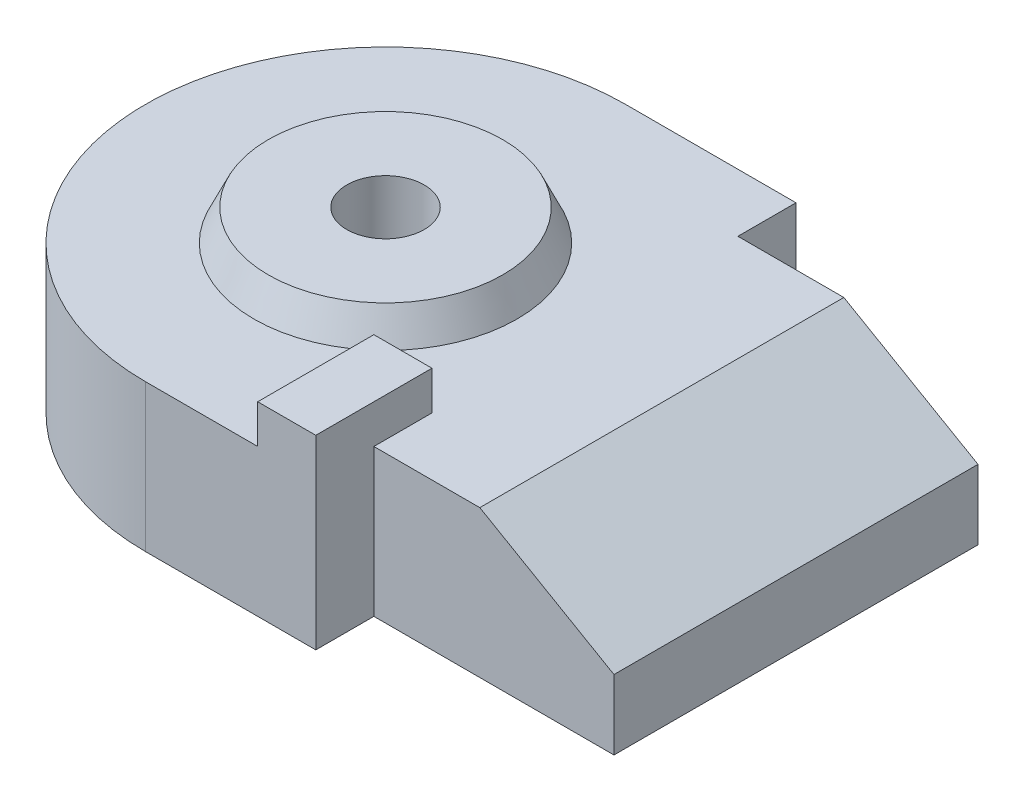
ISO-10303-21;
HEADER;
FILE_DESCRIPTION(('STEP AP214'),'2;1');
FILE_NAME('part.step','',(''),(''),'','','');
FILE_SCHEMA(('AUTOMOTIVE_DESIGN { 1 0 10303 214 1 1 1 1 }'));
ENDSEC;
DATA;
#1=APPLICATION_CONTEXT('core data for automotive mechanical design processes');
#2=APPLICATION_PROTOCOL_DEFINITION('international standard','automotive_design',2000,#1);
#3=PRODUCT_CONTEXT('',#1,'mechanical');
#4=PRODUCT('Part','Part','',(#3));
#5=PRODUCT_RELATED_PRODUCT_CATEGORY('part','',(#4));
#6=PRODUCT_DEFINITION_FORMATION('','',#4);
#7=PRODUCT_DEFINITION_CONTEXT('part definition',#1,'design');
#8=PRODUCT_DEFINITION('design','',#6,#7);
#9=PRODUCT_DEFINITION_SHAPE('','',#8);
#10=(LENGTH_UNIT() NAMED_UNIT(*) SI_UNIT(.MILLI.,.METRE.));
#11=(NAMED_UNIT(*) PLANE_ANGLE_UNIT() SI_UNIT($,.RADIAN.));
#12=(NAMED_UNIT(*) SI_UNIT($,.STERADIAN.) SOLID_ANGLE_UNIT());
#13=UNCERTAINTY_MEASURE_WITH_UNIT(LENGTH_MEASURE(1.E-05),#10,'distance_accuracy_value','');
#14=(GEOMETRIC_REPRESENTATION_CONTEXT(3) GLOBAL_UNCERTAINTY_ASSIGNED_CONTEXT((#13)) GLOBAL_UNIT_ASSIGNED_CONTEXT((#10,
#11,#12)) REPRESENTATION_CONTEXT('',''));
#15=CARTESIAN_POINT('',(0.,0.,0.));
#16=DIRECTION('',(0.,0.,1.));
#17=DIRECTION('',(1.,0.,0.));
#18=AXIS2_PLACEMENT_3D('',#15,#16,#17);
#19=CARTESIAN_POINT('',(-220.,190.,-235.));
#20=DIRECTION('',(0.,-1.,0.));
#21=DIRECTION('',(0.,0.,-1.));
#22=AXIS2_PLACEMENT_3D('',#19,#20,#21);
#23=PLANE('',#22);
#24=CARTESIAN_POINT('',(-220.,190.,-235.));
#25=DIRECTION('',(0.,-1.,0.));
#26=DIRECTION('',(0.,0.,-1.));
#27=AXIS2_PLACEMENT_3D('',#24,#25,#26);
#28=CIRCLE('',#27,170.);
#29=CARTESIAN_POINT('',(-220.,190.,-405.));
#30=VERTEX_POINT('',#29);
#31=EDGE_CURVE('E189',#30,#30,#28,.F.);
#32=ORIENTED_EDGE('',*,*,#31,.F.);
#33=EDGE_LOOP('',(#32));
#34=FACE_BOUND('',#33,.T.);
#35=DIRECTION('',(1.,0.,0.));
#36=VECTOR('',#35,1.);
#37=CARTESIAN_POINT('',(310.,190.,0.));
#38=LINE('',#37,#36);
#39=CARTESIAN_POINT('',(0.,190.,0.));
#40=VERTEX_POINT('',#39);
#41=CARTESIAN_POINT('',(136.794919243114,190.,0.));
#42=VERTEX_POINT('',#41);
#43=EDGE_CURVE('E132',#40,#42,#38,.T.);
#44=ORIENTED_EDGE('',*,*,#43,.T.);
#45=DIRECTION('',(0.,0.,1.));
#46=VECTOR('',#45,1.);
#47=CARTESIAN_POINT('',(136.794919243114,190.,-545.));
#48=LINE('',#47,#46);
#49=CARTESIAN_POINT('',(136.794919243114,190.,-470.));
#50=VERTEX_POINT('',#49);
#51=EDGE_CURVE('E121',#50,#42,#48,.T.);
#52=ORIENTED_EDGE('',*,*,#51,.F.);
#53=DIRECTION('',(-1.,0.,0.));
#54=VECTOR('',#53,1.);
#55=CARTESIAN_POINT('',(0.,190.,-470.));
#56=LINE('',#55,#54);
#57=CARTESIAN_POINT('',(0.,190.,-470.));
#58=VERTEX_POINT('',#57);
#59=EDGE_CURVE('E137',#50,#58,#56,.T.);
#60=ORIENTED_EDGE('',*,*,#59,.T.);
#61=DIRECTION('',(0.,0.,-1.));
#62=VECTOR('',#61,1.);
#63=CARTESIAN_POINT('',(0.,190.,-545.));
#64=LINE('',#63,#62);
#65=CARTESIAN_POINT('',(0.,190.,-545.));
#66=VERTEX_POINT('',#65);
#67=EDGE_CURVE('E140',#58,#66,#64,.T.);
#68=ORIENTED_EDGE('',*,*,#67,.T.);
#69=DIRECTION('',(-1.,0.,0.));
#70=VECTOR('',#69,1.);
#71=CARTESIAN_POINT('',(-220.,190.,-545.));
#72=LINE('',#71,#70);
#73=CARTESIAN_POINT('',(-220.,190.,-545.));
#74=VERTEX_POINT('',#73);
#75=EDGE_CURVE('E149',#66,#74,#72,.T.);
#76=ORIENTED_EDGE('',*,*,#75,.T.);
#77=CARTESIAN_POINT('',(-220.,190.,-235.));
#78=DIRECTION('',(0.,1.,0.));
#79=DIRECTION('',(0.,0.,-1.));
#80=AXIS2_PLACEMENT_3D('',#77,#78,#79);
#81=CIRCLE('',#80,310.);
#82=CARTESIAN_POINT('',(-220.,190.,75.));
#83=VERTEX_POINT('',#82);
#84=EDGE_CURVE('E151',#74,#83,#81,.T.);
#85=ORIENTED_EDGE('',*,*,#84,.T.);
#86=DIRECTION('',(1.,0.,0.));
#87=VECTOR('',#86,1.);
#88=CARTESIAN_POINT('',(0.,190.,75.));
#89=LINE('',#88,#87);
#90=CARTESIAN_POINT('',(-75.,190.,75.));
#91=VERTEX_POINT('',#90);
#92=EDGE_CURVE('E153',#83,#91,#89,.T.);
#93=ORIENTED_EDGE('',*,*,#92,.T.);
#94=DIRECTION('',(0.,0.,1.));
#95=VECTOR('',#94,1.);
#96=CARTESIAN_POINT('',(-75.,190.,75.));
#97=LINE('',#96,#95);
#98=CARTESIAN_POINT('',(-75.,190.,-75.));
#99=VERTEX_POINT('',#98);
#100=EDGE_CURVE('E211',#99,#91,#97,.T.);
#101=ORIENTED_EDGE('',*,*,#100,.F.);
#102=DIRECTION('',(-1.,0.,0.));
#103=VECTOR('',#102,1.);
#104=CARTESIAN_POINT('',(0.,190.,-75.));
#105=LINE('',#104,#103);
#106=CARTESIAN_POINT('',(0.,190.,-75.));
#107=VERTEX_POINT('',#106);
#108=EDGE_CURVE('E57',#107,#99,#105,.T.);
#109=ORIENTED_EDGE('',*,*,#108,.F.);
#110=DIRECTION('',(0.,0.,-1.));
#111=VECTOR('',#110,1.);
#112=CARTESIAN_POINT('',(0.,190.,-235.));
#113=LINE('',#112,#111);
#114=EDGE_CURVE('E43',#40,#107,#113,.T.);
#115=ORIENTED_EDGE('',*,*,#114,.F.);
#116=EDGE_LOOP('',(#44,#52,#60,#68,#76,#85,#93,#101,#109,#115));
#117=FACE_BOUND('',#116,.T.);
#118=ADVANCED_FACE('F35',(#34,#117),#23,.F.);
#119=CARTESIAN_POINT('',(310.,190.,0.));
#120=DIRECTION('',(0.,0.,-1.));
#121=DIRECTION('',(-1.,0.,0.));
#122=AXIS2_PLACEMENT_3D('',#119,#120,#121);
#123=PLANE('',#122);
#124=DIRECTION('',(0.,-1.,0.));
#125=VECTOR('',#124,1.);
#126=CARTESIAN_POINT('',(310.,190.,0.));
#127=LINE('',#126,#125);
#128=CARTESIAN_POINT('',(310.,89.9999999999999,0.));
#129=VERTEX_POINT('',#128);
#130=CARTESIAN_POINT('',(310.,0.,0.));
#131=VERTEX_POINT('',#130);
#132=EDGE_CURVE('E134',#129,#131,#127,.T.);
#133=ORIENTED_EDGE('',*,*,#132,.F.);
#134=DIRECTION('',(0.866025403784436,-0.500000000000004,0.));
#135=VECTOR('',#134,1.);
#136=CARTESIAN_POINT('',(116.471143170301,201.733937586588,0.));
#137=LINE('',#136,#135);
#138=EDGE_CURVE('E124',#42,#129,#137,.T.);
#139=ORIENTED_EDGE('',*,*,#138,.F.);
#140=ORIENTED_EDGE('',*,*,#43,.F.);
#141=DIRECTION('',(0.,-1.,0.));
#142=VECTOR('',#141,1.);
#143=CARTESIAN_POINT('',(0.,190.,0.));
#144=LINE('',#143,#142);
#145=CARTESIAN_POINT('',(0.,0.,0.));
#146=VERTEX_POINT('',#145);
#147=EDGE_CURVE('E155',#40,#146,#144,.T.);
#148=ORIENTED_EDGE('',*,*,#147,.T.);
#149=DIRECTION('',(1.,0.,0.));
#150=VECTOR('',#149,1.);
#151=CARTESIAN_POINT('',(310.,0.,0.));
#152=LINE('',#151,#150);
#153=EDGE_CURVE('E156',#146,#131,#152,.T.);
#154=ORIENTED_EDGE('',*,*,#153,.T.);
#155=EDGE_LOOP('',(#133,#139,#140,#148,#154));
#156=FACE_BOUND('',#155,.T.);
#157=ADVANCED_FACE('F37',(#156),#123,.F.);
#158=CARTESIAN_POINT('',(310.,190.,-470.));
#159=DIRECTION('',(-1.,0.,0.));
#160=DIRECTION('',(0.,0.,1.));
#161=AXIS2_PLACEMENT_3D('',#158,#159,#160);
#162=PLANE('',#161);
#163=DIRECTION('',(0.,-1.,0.));
#164=VECTOR('',#163,1.);
#165=CARTESIAN_POINT('',(310.,190.,-470.));
#166=LINE('',#165,#164);
#167=CARTESIAN_POINT('',(310.,90.,-470.));
#168=VERTEX_POINT('',#167);
#169=CARTESIAN_POINT('',(310.,0.,-470.));
#170=VERTEX_POINT('',#169);
#171=EDGE_CURVE('E186',#168,#170,#166,.T.);
#172=ORIENTED_EDGE('',*,*,#171,.F.);
#173=DIRECTION('',(0.,0.,1.));
#174=VECTOR('',#173,1.);
#175=CARTESIAN_POINT('',(310.,89.9999999999999,-545.));
#176=LINE('',#175,#174);
#177=EDGE_CURVE('E50',#168,#129,#176,.T.);
#178=ORIENTED_EDGE('',*,*,#177,.T.);
#179=ORIENTED_EDGE('',*,*,#132,.T.);
#180=DIRECTION('',(0.,0.,-1.));
#181=VECTOR('',#180,1.);
#182=CARTESIAN_POINT('',(310.,0.,-470.));
#183=LINE('',#182,#181);
#184=EDGE_CURVE('E158',#131,#170,#183,.T.);
#185=ORIENTED_EDGE('',*,*,#184,.T.);
#186=EDGE_LOOP('',(#172,#178,#179,#185));
#187=FACE_BOUND('',#186,.T.);
#188=ADVANCED_FACE('F230',(#187),#162,.F.);
#189=CARTESIAN_POINT('',(0.,190.,-470.));
#190=DIRECTION('',(0.,0.,1.));
#191=DIRECTION('',(1.,0.,0.));
#192=AXIS2_PLACEMENT_3D('',#189,#190,#191);
#193=PLANE('',#192);
#194=ORIENTED_EDGE('',*,*,#59,.F.);
#195=DIRECTION('',(0.866025403784436,-0.500000000000004,0.));
#196=VECTOR('',#195,1.);
#197=CARTESIAN_POINT('',(34.1987298107791,249.233937586589,-470.));
#198=LINE('',#197,#196);
#199=EDGE_CURVE('E11',#50,#168,#198,.T.);
#200=ORIENTED_EDGE('',*,*,#199,.T.);
#201=ORIENTED_EDGE('',*,*,#171,.T.);
#202=DIRECTION('',(-1.,0.,0.));
#203=VECTOR('',#202,1.);
#204=CARTESIAN_POINT('',(0.,0.,-470.));
#205=LINE('',#204,#203);
#206=CARTESIAN_POINT('',(0.,0.,-470.));
#207=VERTEX_POINT('',#206);
#208=EDGE_CURVE('E161',#170,#207,#205,.T.);
#209=ORIENTED_EDGE('',*,*,#208,.T.);
#210=DIRECTION('',(0.,-1.,0.));
#211=VECTOR('',#210,1.);
#212=CARTESIAN_POINT('',(0.,190.,-470.));
#213=LINE('',#212,#211);
#214=EDGE_CURVE('E183',#58,#207,#213,.T.);
#215=ORIENTED_EDGE('',*,*,#214,.F.);
#216=EDGE_LOOP('',(#194,#200,#201,#209,#215));
#217=FACE_BOUND('',#216,.T.);
#218=ADVANCED_FACE('F234',(#217),#193,.F.);
#219=CARTESIAN_POINT('',(0.,190.,-545.));
#220=DIRECTION('',(-1.,0.,0.));
#221=DIRECTION('',(0.,0.,1.));
#222=AXIS2_PLACEMENT_3D('',#219,#220,#221);
#223=PLANE('',#222);
#224=DIRECTION('',(0.,0.,-1.));
#225=VECTOR('',#224,1.);
#226=CARTESIAN_POINT('',(0.,0.,-545.));
#227=LINE('',#226,#225);
#228=CARTESIAN_POINT('',(0.,0.,-545.));
#229=VERTEX_POINT('',#228);
#230=EDGE_CURVE('E163',#207,#229,#227,.T.);
#231=ORIENTED_EDGE('',*,*,#230,.T.);
#232=DIRECTION('',(0.,-1.,0.));
#233=VECTOR('',#232,1.);
#234=CARTESIAN_POINT('',(0.,190.,-545.));
#235=LINE('',#234,#233);
#236=EDGE_CURVE('E180',#66,#229,#235,.T.);
#237=ORIENTED_EDGE('',*,*,#236,.F.);
#238=ORIENTED_EDGE('',*,*,#67,.F.);
#239=ORIENTED_EDGE('',*,*,#214,.T.);
#240=EDGE_LOOP('',(#231,#237,#238,#239));
#241=FACE_BOUND('',#240,.T.);
#242=ADVANCED_FACE('F241',(#241),#223,.F.);
#243=CARTESIAN_POINT('',(-220.,190.,-545.));
#244=DIRECTION('',(0.,0.,1.));
#245=DIRECTION('',(1.,0.,0.));
#246=AXIS2_PLACEMENT_3D('',#243,#244,#245);
#247=PLANE('',#246);
#248=DIRECTION('',(-1.,0.,0.));
#249=VECTOR('',#248,1.);
#250=CARTESIAN_POINT('',(-220.,0.,-545.));
#251=LINE('',#250,#249);
#252=CARTESIAN_POINT('',(-220.,0.,-545.));
#253=VERTEX_POINT('',#252);
#254=EDGE_CURVE('E165',#229,#253,#251,.T.);
#255=ORIENTED_EDGE('',*,*,#254,.T.);
#256=DIRECTION('',(0.,-1.,0.));
#257=VECTOR('',#256,1.);
#258=CARTESIAN_POINT('',(-220.,190.,-545.));
#259=LINE('',#258,#257);
#260=EDGE_CURVE('E177',#74,#253,#259,.T.);
#261=ORIENTED_EDGE('',*,*,#260,.F.);
#262=ORIENTED_EDGE('',*,*,#75,.F.);
#263=ORIENTED_EDGE('',*,*,#236,.T.);
#264=EDGE_LOOP('',(#255,#261,#262,#263));
#265=FACE_BOUND('',#264,.T.);
#266=ADVANCED_FACE('F245',(#265),#247,.F.);
#267=CARTESIAN_POINT('',(-220.,190.,-235.));
#268=DIRECTION('',(0.,-1.,0.));
#269=DIRECTION('',(0.,0.,-1.));
#270=AXIS2_PLACEMENT_3D('',#267,#268,#269);
#271=CYLINDRICAL_SURFACE('',#270,310.);
#272=CARTESIAN_POINT('',(-220.,0.,-235.));
#273=DIRECTION('',(0.,1.,0.));
#274=DIRECTION('',(0.,0.,-1.));
#275=AXIS2_PLACEMENT_3D('',#272,#273,#274);
#276=CIRCLE('',#275,310.);
#277=CARTESIAN_POINT('',(-220.,0.,75.));
#278=VERTEX_POINT('',#277);
#279=EDGE_CURVE('E167',#253,#278,#276,.T.);
#280=ORIENTED_EDGE('',*,*,#279,.T.);
#281=DIRECTION('',(0.,-1.,0.));
#282=VECTOR('',#281,1.);
#283=CARTESIAN_POINT('',(-220.,190.,75.));
#284=LINE('',#283,#282);
#285=EDGE_CURVE('E174',#83,#278,#284,.T.);
#286=ORIENTED_EDGE('',*,*,#285,.F.);
#287=ORIENTED_EDGE('',*,*,#84,.F.);
#288=ORIENTED_EDGE('',*,*,#260,.T.);
#289=EDGE_LOOP('',(#280,#286,#287,#288));
#290=FACE_BOUND('',#289,.T.);
#291=ADVANCED_FACE('F250',(#290),#271,.T.);
#292=CARTESIAN_POINT('',(0.,190.,75.));
#293=DIRECTION('',(0.,0.,-1.));
#294=DIRECTION('',(-1.,0.,0.));
#295=AXIS2_PLACEMENT_3D('',#292,#293,#294);
#296=PLANE('',#295);
#297=DIRECTION('',(1.,0.,0.));
#298=VECTOR('',#297,1.);
#299=CARTESIAN_POINT('',(0.,0.,75.));
#300=LINE('',#299,#298);
#301=CARTESIAN_POINT('',(0.,0.,75.));
#302=VERTEX_POINT('',#301);
#303=EDGE_CURVE('E142',#278,#302,#300,.T.);
#304=ORIENTED_EDGE('',*,*,#303,.T.);
#305=DIRECTION('',(0.,-1.,0.));
#306=VECTOR('',#305,1.);
#307=CARTESIAN_POINT('',(0.,190.,75.));
#308=LINE('',#307,#306);
#309=CARTESIAN_POINT('',(0.,240.,75.));
#310=VERTEX_POINT('',#309);
#311=EDGE_CURVE('E171',#310,#302,#308,.T.);
#312=ORIENTED_EDGE('',*,*,#311,.F.);
#313=DIRECTION('',(1.,0.,0.));
#314=VECTOR('',#313,1.);
#315=CARTESIAN_POINT('',(0.,240.,75.));
#316=LINE('',#315,#314);
#317=CARTESIAN_POINT('',(-75.,240.,75.));
#318=VERTEX_POINT('',#317);
#319=EDGE_CURVE('E210',#318,#310,#316,.T.);
#320=ORIENTED_EDGE('',*,*,#319,.F.);
#321=DIRECTION('',(0.,-1.,0.));
#322=VECTOR('',#321,1.);
#323=CARTESIAN_POINT('',(-75.,240.,75.));
#324=LINE('',#323,#322);
#325=EDGE_CURVE('E205',#318,#91,#324,.T.);
#326=ORIENTED_EDGE('',*,*,#325,.T.);
#327=ORIENTED_EDGE('',*,*,#92,.F.);
#328=ORIENTED_EDGE('',*,*,#285,.T.);
#329=EDGE_LOOP('',(#304,#312,#320,#326,#327,#328));
#330=FACE_BOUND('',#329,.T.);
#331=ADVANCED_FACE('F258',(#330),#296,.F.);
#332=CARTESIAN_POINT('',(0.,190.,0.));
#333=DIRECTION('',(-1.,0.,0.));
#334=DIRECTION('',(0.,0.,1.));
#335=AXIS2_PLACEMENT_3D('',#332,#333,#334);
#336=PLANE('',#335);
#337=DIRECTION('',(0.,0.,-1.));
#338=VECTOR('',#337,1.);
#339=CARTESIAN_POINT('',(0.,0.,0.));
#340=LINE('',#339,#338);
#341=EDGE_CURVE('E138',#302,#146,#340,.T.);
#342=ORIENTED_EDGE('',*,*,#341,.T.);
#343=ORIENTED_EDGE('',*,*,#147,.F.);
#344=ORIENTED_EDGE('',*,*,#114,.T.);
#345=DIRECTION('',(0.,-1.,0.));
#346=VECTOR('',#345,1.);
#347=CARTESIAN_POINT('',(0.,240.,-75.));
#348=LINE('',#347,#346);
#349=CARTESIAN_POINT('',(0.,240.,-75.));
#350=VERTEX_POINT('',#349);
#351=EDGE_CURVE('E196',#350,#107,#348,.T.);
#352=ORIENTED_EDGE('',*,*,#351,.F.);
#353=DIRECTION('',(0.,0.,-1.));
#354=VECTOR('',#353,1.);
#355=CARTESIAN_POINT('',(0.,240.,75.));
#356=LINE('',#355,#354);
#357=EDGE_CURVE('E214',#310,#350,#356,.T.);
#358=ORIENTED_EDGE('',*,*,#357,.F.);
#359=ORIENTED_EDGE('',*,*,#311,.T.);
#360=EDGE_LOOP('',(#342,#343,#344,#352,#358,#359));
#361=FACE_BOUND('',#360,.T.);
#362=ADVANCED_FACE('F194',(#361),#336,.F.);
#363=CARTESIAN_POINT('',(-220.,0.,-235.));
#364=DIRECTION('',(0.,-1.,0.));
#365=DIRECTION('',(0.,0.,-1.));
#366=AXIS2_PLACEMENT_3D('',#363,#364,#365);
#367=PLANE('',#366);
#368=CARTESIAN_POINT('',(-220.,0.,-235.));
#369=DIRECTION('',(0.,1.,0.));
#370=DIRECTION('',(0.,0.,1.));
#371=AXIS2_PLACEMENT_3D('',#368,#369,#370);
#372=CIRCLE('',#371,50.);
#373=CARTESIAN_POINT('',(-220.,0.,-185.));
#374=VERTEX_POINT('',#373);
#375=EDGE_CURVE('E216',#374,#374,#372,.T.);
#376=ORIENTED_EDGE('',*,*,#375,.T.);
#377=EDGE_LOOP('',(#376));
#378=FACE_BOUND('',#377,.T.);
#379=ORIENTED_EDGE('',*,*,#153,.F.);
#380=ORIENTED_EDGE('',*,*,#341,.F.);
#381=ORIENTED_EDGE('',*,*,#303,.F.);
#382=ORIENTED_EDGE('',*,*,#279,.F.);
#383=ORIENTED_EDGE('',*,*,#254,.F.);
#384=ORIENTED_EDGE('',*,*,#230,.F.);
#385=ORIENTED_EDGE('',*,*,#208,.F.);
#386=ORIENTED_EDGE('',*,*,#184,.F.);
#387=EDGE_LOOP('',(#379,#380,#381,#382,#383,#384,#385,#386));
#388=FACE_BOUND('',#387,.T.);
#389=ADVANCED_FACE('F265',(#378,#388),#367,.T.);
#390=CARTESIAN_POINT('',(-220.,190.,-235.));
#391=DIRECTION('',(0.,-1.,0.));
#392=DIRECTION('',(0.,0.,1.));
#393=AXIS2_PLACEMENT_3D('',#390,#391,#392);
#394=CONICAL_SURFACE('',#393,170.,0.436332312998583);
#395=CARTESIAN_POINT('',(-220.,230.,-235.));
#396=DIRECTION('',(0.,1.,0.));
#397=DIRECTION('',(0.,0.,1.));
#398=AXIS2_PLACEMENT_3D('',#395,#396,#397);
#399=CIRCLE('',#398,151.3476936738);
#400=CARTESIAN_POINT('',(-220.,230.,-83.6523063261999));
#401=VERTEX_POINT('',#400);
#402=EDGE_CURVE('E145',#401,#401,#399,.T.);
#403=ORIENTED_EDGE('',*,*,#402,.F.);
#404=EDGE_LOOP('',(#403));
#405=FACE_BOUND('',#404,.T.);
#406=ORIENTED_EDGE('',*,*,#31,.T.);
#407=EDGE_LOOP('',(#406));
#408=FACE_BOUND('',#407,.T.);
#409=ADVANCED_FACE('F267',(#405,#408),#394,.T.);
#410=CARTESIAN_POINT('',(-220.,230.,-235.));
#411=DIRECTION('',(0.,1.,0.));
#412=DIRECTION('',(0.,0.,1.));
#413=AXIS2_PLACEMENT_3D('',#410,#411,#412);
#414=PLANE('',#413);
#415=CARTESIAN_POINT('',(-220.,230.,-235.));
#416=DIRECTION('',(0.,1.,0.));
#417=DIRECTION('',(0.,0.,1.));
#418=AXIS2_PLACEMENT_3D('',#415,#416,#417);
#419=CIRCLE('',#418,50.);
#420=CARTESIAN_POINT('',(-220.,230.,-185.));
#421=VERTEX_POINT('',#420);
#422=EDGE_CURVE('E223',#421,#421,#419,.T.);
#423=ORIENTED_EDGE('',*,*,#422,.F.);
#424=EDGE_LOOP('',(#423));
#425=FACE_BOUND('',#424,.T.);
#426=ORIENTED_EDGE('',*,*,#402,.T.);
#427=EDGE_LOOP('',(#426));
#428=FACE_BOUND('',#427,.T.);
#429=ADVANCED_FACE('F274',(#425,#428),#414,.T.);
#430=CARTESIAN_POINT('',(0.,240.,-75.));
#431=DIRECTION('',(0.,0.,1.));
#432=DIRECTION('',(1.,0.,0.));
#433=AXIS2_PLACEMENT_3D('',#430,#431,#432);
#434=PLANE('',#433);
#435=ORIENTED_EDGE('',*,*,#108,.T.);
#436=DIRECTION('',(0.,-1.,0.));
#437=VECTOR('',#436,1.);
#438=CARTESIAN_POINT('',(-75.,240.,-75.));
#439=LINE('',#438,#437);
#440=CARTESIAN_POINT('',(-75.,240.,-75.));
#441=VERTEX_POINT('',#440);
#442=EDGE_CURVE('E203',#441,#99,#439,.T.);
#443=ORIENTED_EDGE('',*,*,#442,.F.);
#444=DIRECTION('',(-1.,0.,0.));
#445=VECTOR('',#444,1.);
#446=CARTESIAN_POINT('',(0.,240.,-75.));
#447=LINE('',#446,#445);
#448=EDGE_CURVE('E201',#350,#441,#447,.T.);
#449=ORIENTED_EDGE('',*,*,#448,.F.);
#450=ORIENTED_EDGE('',*,*,#351,.T.);
#451=EDGE_LOOP('',(#435,#443,#449,#450));
#452=FACE_BOUND('',#451,.T.);
#453=ADVANCED_FACE('F198',(#452),#434,.F.);
#454=CARTESIAN_POINT('',(-75.,240.,75.));
#455=DIRECTION('',(1.,0.,0.));
#456=DIRECTION('',(0.,0.,-1.));
#457=AXIS2_PLACEMENT_3D('',#454,#455,#456);
#458=PLANE('',#457);
#459=ORIENTED_EDGE('',*,*,#100,.T.);
#460=ORIENTED_EDGE('',*,*,#325,.F.);
#461=DIRECTION('',(0.,0.,1.));
#462=VECTOR('',#461,1.);
#463=CARTESIAN_POINT('',(-75.,240.,75.));
#464=LINE('',#463,#462);
#465=EDGE_CURVE('E219',#441,#318,#464,.T.);
#466=ORIENTED_EDGE('',*,*,#465,.F.);
#467=ORIENTED_EDGE('',*,*,#442,.T.);
#468=EDGE_LOOP('',(#459,#460,#466,#467));
#469=FACE_BOUND('',#468,.T.);
#470=ADVANCED_FACE('F255',(#469),#458,.F.);
#471=CARTESIAN_POINT('',(0.,240.,0.));
#472=DIRECTION('',(0.,1.,0.));
#473=DIRECTION('',(0.,0.,1.));
#474=AXIS2_PLACEMENT_3D('',#471,#472,#473);
#475=PLANE('',#474);
#476=ORIENTED_EDGE('',*,*,#357,.T.);
#477=ORIENTED_EDGE('',*,*,#448,.T.);
#478=ORIENTED_EDGE('',*,*,#465,.T.);
#479=ORIENTED_EDGE('',*,*,#319,.T.);
#480=EDGE_LOOP('',(#476,#477,#478,#479));
#481=FACE_BOUND('',#480,.T.);
#482=ADVANCED_FACE('F260',(#481),#475,.T.);
#483=CARTESIAN_POINT('',(-220.,0.,-235.));
#484=DIRECTION('',(0.,1.,0.));
#485=DIRECTION('',(0.,0.,1.));
#486=AXIS2_PLACEMENT_3D('',#483,#484,#485);
#487=CYLINDRICAL_SURFACE('',#486,50.);
#488=ORIENTED_EDGE('',*,*,#375,.F.);
#489=EDGE_LOOP('',(#488));
#490=FACE_BOUND('',#489,.T.);
#491=ORIENTED_EDGE('',*,*,#422,.T.);
#492=EDGE_LOOP('',(#491));
#493=FACE_BOUND('',#492,.T.);
#494=ADVANCED_FACE('F295',(#490,#493),#487,.F.);
#495=CARTESIAN_POINT('',(116.471143170301,201.733937586588,-545.));
#496=DIRECTION('',(-0.500000000000004,-0.866025403784436,0.));
#497=DIRECTION('',(0.866025403784436,-0.500000000000004,0.));
#498=AXIS2_PLACEMENT_3D('',#495,#496,#497);
#499=PLANE('',#498);
#500=ORIENTED_EDGE('',*,*,#51,.T.);
#501=ORIENTED_EDGE('',*,*,#138,.T.);
#502=ORIENTED_EDGE('',*,*,#177,.F.);
#503=ORIENTED_EDGE('',*,*,#199,.F.);
#504=EDGE_LOOP('',(#500,#501,#502,#503));
#505=FACE_BOUND('',#504,.T.);
#506=ADVANCED_FACE('F123',(#505),#499,.F.);
#507=CLOSED_SHELL('',(#118,#157,#188,#218,#242,#266,#291,#331,#362,#389,#409,#429,#453,#470,
#482,#494,#506));
#508=MANIFOLD_SOLID_BREP('B2',#507);
#509=ADVANCED_BREP_SHAPE_REPRESENTATION('',(#18,#508),#14);
#510=SHAPE_DEFINITION_REPRESENTATION(#9,#509);
ENDSEC;
END-ISO-10303-21;
